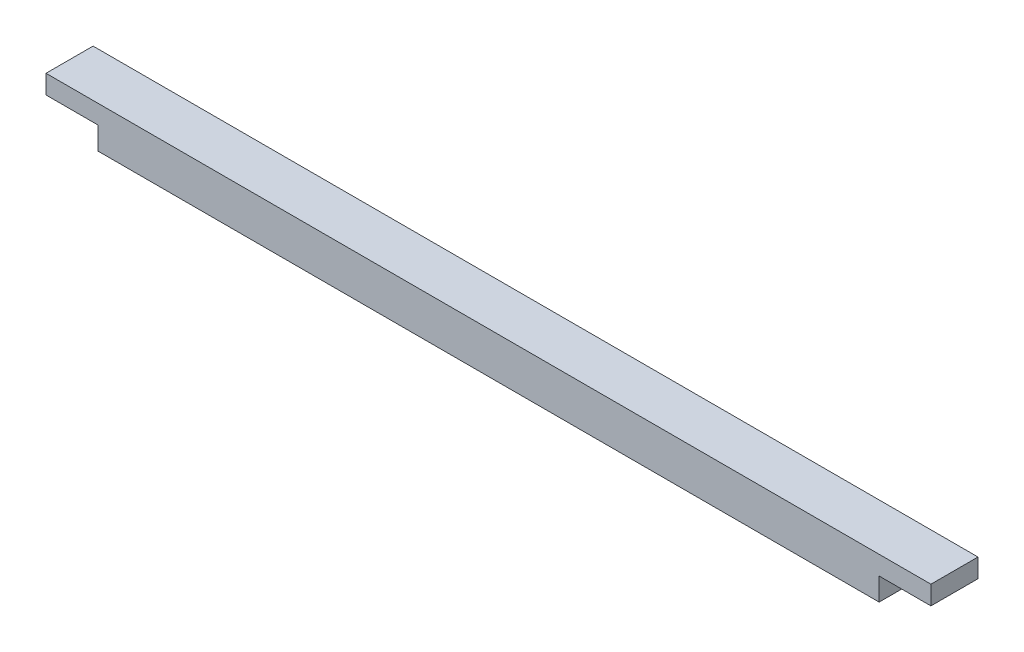
ISO-10303-21;
HEADER;
FILE_DESCRIPTION(('STEP AP214'),'2;1');
FILE_NAME('part.step','',(''),(''),'','','');
FILE_SCHEMA(('AUTOMOTIVE_DESIGN { 1 0 10303 214 1 1 1 1 }'));
ENDSEC;
DATA;
#1=APPLICATION_CONTEXT('core data for automotive mechanical design processes');
#2=APPLICATION_PROTOCOL_DEFINITION('international standard','automotive_design',2000,#1);
#3=PRODUCT_CONTEXT('',#1,'mechanical');
#4=PRODUCT('Part','Part','',(#3));
#5=PRODUCT_RELATED_PRODUCT_CATEGORY('part','',(#4));
#6=PRODUCT_DEFINITION_FORMATION('','',#4);
#7=PRODUCT_DEFINITION_CONTEXT('part definition',#1,'design');
#8=PRODUCT_DEFINITION('design','',#6,#7);
#9=PRODUCT_DEFINITION_SHAPE('','',#8);
#10=(LENGTH_UNIT() NAMED_UNIT(*) SI_UNIT(.MILLI.,.METRE.));
#11=(NAMED_UNIT(*) PLANE_ANGLE_UNIT() SI_UNIT($,.RADIAN.));
#12=(NAMED_UNIT(*) SI_UNIT($,.STERADIAN.) SOLID_ANGLE_UNIT());
#13=UNCERTAINTY_MEASURE_WITH_UNIT(LENGTH_MEASURE(1.E-05),#10,'distance_accuracy_value','');
#14=(GEOMETRIC_REPRESENTATION_CONTEXT(3) GLOBAL_UNCERTAINTY_ASSIGNED_CONTEXT((#13)) GLOBAL_UNIT_ASSIGNED_CONTEXT((#10,
#11,#12)) REPRESENTATION_CONTEXT('',''));
#15=CARTESIAN_POINT('',(0.,0.,0.));
#16=DIRECTION('',(0.,0.,1.));
#17=DIRECTION('',(1.,0.,0.));
#18=AXIS2_PLACEMENT_3D('',#15,#16,#17);
#19=CARTESIAN_POINT('',(0.,22.,0.));
#20=DIRECTION('',(1.,0.,0.));
#21=DIRECTION('',(0.,0.,-1.));
#22=AXIS2_PLACEMENT_3D('',#19,#20,#21);
#23=PLANE('',#22);
#24=DIRECTION('',(0.,-1.,0.));
#25=VECTOR('',#24,1.);
#26=CARTESIAN_POINT('',(0.,22.,-25.));
#27=LINE('',#26,#25);
#28=CARTESIAN_POINT('',(0.,22.,-25.));
#29=VERTEX_POINT('',#28);
#30=CARTESIAN_POINT('',(0.,12.,-25.));
#31=VERTEX_POINT('',#30);
#32=EDGE_CURVE('E156',#29,#31,#27,.T.);
#33=ORIENTED_EDGE('',*,*,#32,.T.);
#34=DIRECTION('',(0.,0.,1.));
#35=VECTOR('',#34,1.);
#36=CARTESIAN_POINT('',(0.,12.,-25.));
#37=LINE('',#36,#35);
#38=CARTESIAN_POINT('',(0.,12.,0.));
#39=VERTEX_POINT('',#38);
#40=EDGE_CURVE('E107',#31,#39,#37,.T.);
#41=ORIENTED_EDGE('',*,*,#40,.T.);
#42=DIRECTION('',(0.,-1.,0.));
#43=VECTOR('',#42,1.);
#44=CARTESIAN_POINT('',(0.,22.,0.));
#45=LINE('',#44,#43);
#46=CARTESIAN_POINT('',(0.,22.,0.));
#47=VERTEX_POINT('',#46);
#48=EDGE_CURVE('E11',#47,#39,#45,.T.);
#49=ORIENTED_EDGE('',*,*,#48,.F.);
#50=DIRECTION('',(0.,0.,1.));
#51=VECTOR('',#50,1.);
#52=CARTESIAN_POINT('',(0.,22.,0.));
#53=LINE('',#52,#51);
#54=EDGE_CURVE('E147',#29,#47,#53,.T.);
#55=ORIENTED_EDGE('',*,*,#54,.F.);
#56=EDGE_LOOP('',(#33,#41,#49,#55));
#57=FACE_BOUND('',#56,.T.);
#58=ADVANCED_FACE('F37',(#57),#23,.F.);
#59=CARTESIAN_POINT('',(0.,22.,0.));
#60=DIRECTION('',(0.,0.,-1.));
#61=DIRECTION('',(-1.,0.,0.));
#62=AXIS2_PLACEMENT_3D('',#59,#60,#61);
#63=PLANE('',#62);
#64=ORIENTED_EDGE('',*,*,#48,.T.);
#65=DIRECTION('',(-1.,0.,0.));
#66=VECTOR('',#65,1.);
#67=CARTESIAN_POINT('',(0.,12.,0.));
#68=LINE('',#67,#66);
#69=CARTESIAN_POINT('',(27.5,12.,0.));
#70=VERTEX_POINT('',#69);
#71=EDGE_CURVE('E123',#70,#39,#68,.T.);
#72=ORIENTED_EDGE('',*,*,#71,.F.);
#73=DIRECTION('',(0.,1.,0.));
#74=VECTOR('',#73,1.);
#75=CARTESIAN_POINT('',(27.5,0.,0.));
#76=LINE('',#75,#74);
#77=CARTESIAN_POINT('',(27.5,0.,0.));
#78=VERTEX_POINT('',#77);
#79=EDGE_CURVE('E104',#78,#70,#76,.T.);
#80=ORIENTED_EDGE('',*,*,#79,.F.);
#81=DIRECTION('',(1.,0.,0.));
#82=VECTOR('',#81,1.);
#83=CARTESIAN_POINT('',(0.,0.,0.));
#84=LINE('',#83,#82);
#85=CARTESIAN_POINT('',(442.5,0.,0.));
#86=VERTEX_POINT('',#85);
#87=EDGE_CURVE('E59',#78,#86,#84,.T.);
#88=ORIENTED_EDGE('',*,*,#87,.T.);
#89=DIRECTION('',(0.,-1.,0.));
#90=VECTOR('',#89,1.);
#91=CARTESIAN_POINT('',(442.5,0.,0.));
#92=LINE('',#91,#90);
#93=CARTESIAN_POINT('',(442.5,12.,0.));
#94=VERTEX_POINT('',#93);
#95=EDGE_CURVE('E135',#94,#86,#92,.T.);
#96=ORIENTED_EDGE('',*,*,#95,.F.);
#97=DIRECTION('',(-1.,0.,0.));
#98=VECTOR('',#97,1.);
#99=CARTESIAN_POINT('',(470.,12.,0.));
#100=LINE('',#99,#98);
#101=CARTESIAN_POINT('',(470.,12.,0.));
#102=VERTEX_POINT('',#101);
#103=EDGE_CURVE('E128',#102,#94,#100,.T.);
#104=ORIENTED_EDGE('',*,*,#103,.F.);
#105=DIRECTION('',(0.,-1.,0.));
#106=VECTOR('',#105,1.);
#107=CARTESIAN_POINT('',(470.,22.,0.));
#108=LINE('',#107,#106);
#109=CARTESIAN_POINT('',(470.,22.,0.));
#110=VERTEX_POINT('',#109);
#111=EDGE_CURVE('E44',#110,#102,#108,.T.);
#112=ORIENTED_EDGE('',*,*,#111,.F.);
#113=DIRECTION('',(1.,0.,0.));
#114=VECTOR('',#113,1.);
#115=CARTESIAN_POINT('',(0.,22.,0.));
#116=LINE('',#115,#114);
#117=EDGE_CURVE('E150',#47,#110,#116,.T.);
#118=ORIENTED_EDGE('',*,*,#117,.F.);
#119=EDGE_LOOP('',(#64,#72,#80,#88,#96,#104,#112,#118));
#120=FACE_BOUND('',#119,.T.);
#121=ADVANCED_FACE('F170',(#120),#63,.F.);
#122=CARTESIAN_POINT('',(470.,22.,0.));
#123=DIRECTION('',(-1.,0.,0.));
#124=DIRECTION('',(0.,0.,1.));
#125=AXIS2_PLACEMENT_3D('',#122,#123,#124);
#126=PLANE('',#125);
#127=ORIENTED_EDGE('',*,*,#111,.T.);
#128=DIRECTION('',(0.,0.,1.));
#129=VECTOR('',#128,1.);
#130=CARTESIAN_POINT('',(470.,12.,-25.));
#131=LINE('',#130,#129);
#132=CARTESIAN_POINT('',(470.,12.,-25.));
#133=VERTEX_POINT('',#132);
#134=EDGE_CURVE('E137',#133,#102,#131,.T.);
#135=ORIENTED_EDGE('',*,*,#134,.F.);
#136=DIRECTION('',(0.,-1.,0.));
#137=VECTOR('',#136,1.);
#138=CARTESIAN_POINT('',(470.,22.,-25.));
#139=LINE('',#138,#137);
#140=CARTESIAN_POINT('',(470.,22.,-25.));
#141=VERTEX_POINT('',#140);
#142=EDGE_CURVE('E160',#141,#133,#139,.T.);
#143=ORIENTED_EDGE('',*,*,#142,.F.);
#144=DIRECTION('',(0.,0.,-1.));
#145=VECTOR('',#144,1.);
#146=CARTESIAN_POINT('',(470.,22.,0.));
#147=LINE('',#146,#145);
#148=EDGE_CURVE('E152',#110,#141,#147,.T.);
#149=ORIENTED_EDGE('',*,*,#148,.F.);
#150=EDGE_LOOP('',(#127,#135,#143,#149));
#151=FACE_BOUND('',#150,.T.);
#152=ADVANCED_FACE('F167',(#151),#126,.F.);
#153=CARTESIAN_POINT('',(0.,22.,-25.));
#154=DIRECTION('',(0.,0.,1.));
#155=DIRECTION('',(1.,0.,0.));
#156=AXIS2_PLACEMENT_3D('',#153,#154,#155);
#157=PLANE('',#156);
#158=DIRECTION('',(0.,1.,0.));
#159=VECTOR('',#158,1.);
#160=CARTESIAN_POINT('',(27.5,0.,-25.));
#161=LINE('',#160,#159);
#162=CARTESIAN_POINT('',(27.5,0.,-25.));
#163=VERTEX_POINT('',#162);
#164=CARTESIAN_POINT('',(27.5,12.,-25.));
#165=VERTEX_POINT('',#164);
#166=EDGE_CURVE('E51',#163,#165,#161,.T.);
#167=ORIENTED_EDGE('',*,*,#166,.T.);
#168=DIRECTION('',(-1.,0.,0.));
#169=VECTOR('',#168,1.);
#170=CARTESIAN_POINT('',(0.,12.,-25.));
#171=LINE('',#170,#169);
#172=EDGE_CURVE('E111',#165,#31,#171,.T.);
#173=ORIENTED_EDGE('',*,*,#172,.T.);
#174=ORIENTED_EDGE('',*,*,#32,.F.);
#175=DIRECTION('',(-1.,0.,0.));
#176=VECTOR('',#175,1.);
#177=CARTESIAN_POINT('',(0.,22.,-25.));
#178=LINE('',#177,#176);
#179=EDGE_CURVE('E154',#141,#29,#178,.T.);
#180=ORIENTED_EDGE('',*,*,#179,.F.);
#181=ORIENTED_EDGE('',*,*,#142,.T.);
#182=DIRECTION('',(-1.,0.,0.));
#183=VECTOR('',#182,1.);
#184=CARTESIAN_POINT('',(470.,12.,-25.));
#185=LINE('',#184,#183);
#186=CARTESIAN_POINT('',(442.5,12.,-25.));
#187=VERTEX_POINT('',#186);
#188=EDGE_CURVE('E131',#133,#187,#185,.T.);
#189=ORIENTED_EDGE('',*,*,#188,.T.);
#190=DIRECTION('',(0.,-1.,0.));
#191=VECTOR('',#190,1.);
#192=CARTESIAN_POINT('',(442.5,0.,-25.));
#193=LINE('',#192,#191);
#194=CARTESIAN_POINT('',(442.5,0.,-25.));
#195=VERTEX_POINT('',#194);
#196=EDGE_CURVE('E134',#187,#195,#193,.T.);
#197=ORIENTED_EDGE('',*,*,#196,.T.);
#198=DIRECTION('',(-1.,0.,0.));
#199=VECTOR('',#198,1.);
#200=CARTESIAN_POINT('',(0.,0.,-25.));
#201=LINE('',#200,#199);
#202=EDGE_CURVE('E122',#195,#163,#201,.T.);
#203=ORIENTED_EDGE('',*,*,#202,.T.);
#204=EDGE_LOOP('',(#167,#173,#174,#180,#181,#189,#197,#203));
#205=FACE_BOUND('',#204,.T.);
#206=ADVANCED_FACE('F119',(#205),#157,.F.);
#207=CARTESIAN_POINT('',(0.,22.,0.));
#208=DIRECTION('',(0.,-1.,0.));
#209=DIRECTION('',(0.,0.,-1.));
#210=AXIS2_PLACEMENT_3D('',#207,#208,#209);
#211=PLANE('',#210);
#212=ORIENTED_EDGE('',*,*,#54,.T.);
#213=ORIENTED_EDGE('',*,*,#117,.T.);
#214=ORIENTED_EDGE('',*,*,#148,.T.);
#215=ORIENTED_EDGE('',*,*,#179,.T.);
#216=EDGE_LOOP('',(#212,#213,#214,#215));
#217=FACE_BOUND('',#216,.T.);
#218=ADVANCED_FACE('F177',(#217),#211,.F.);
#219=CARTESIAN_POINT('',(0.,0.,0.));
#220=DIRECTION('',(0.,-1.,0.));
#221=DIRECTION('',(0.,0.,-1.));
#222=AXIS2_PLACEMENT_3D('',#219,#220,#221);
#223=PLANE('',#222);
#224=DIRECTION('',(0.,0.,1.));
#225=VECTOR('',#224,1.);
#226=CARTESIAN_POINT('',(27.5,0.,-25.));
#227=LINE('',#226,#225);
#228=EDGE_CURVE('E108',#163,#78,#227,.T.);
#229=ORIENTED_EDGE('',*,*,#228,.F.);
#230=ORIENTED_EDGE('',*,*,#202,.F.);
#231=DIRECTION('',(0.,0.,1.));
#232=VECTOR('',#231,1.);
#233=CARTESIAN_POINT('',(442.5,0.,-25.));
#234=LINE('',#233,#232);
#235=EDGE_CURVE('E141',#195,#86,#234,.T.);
#236=ORIENTED_EDGE('',*,*,#235,.T.);
#237=ORIENTED_EDGE('',*,*,#87,.F.);
#238=EDGE_LOOP('',(#229,#230,#236,#237));
#239=FACE_BOUND('',#238,.T.);
#240=ADVANCED_FACE('F181',(#239),#223,.T.);
#241=CARTESIAN_POINT('',(442.5,0.,-25.));
#242=DIRECTION('',(-1.,0.,0.));
#243=DIRECTION('',(0.,0.,1.));
#244=AXIS2_PLACEMENT_3D('',#241,#242,#243);
#245=PLANE('',#244);
#246=ORIENTED_EDGE('',*,*,#95,.T.);
#247=ORIENTED_EDGE('',*,*,#235,.F.);
#248=ORIENTED_EDGE('',*,*,#196,.F.);
#249=DIRECTION('',(0.,0.,1.));
#250=VECTOR('',#249,1.);
#251=CARTESIAN_POINT('',(442.5,12.,-25.));
#252=LINE('',#251,#250);
#253=EDGE_CURVE('E144',#187,#94,#252,.T.);
#254=ORIENTED_EDGE('',*,*,#253,.T.);
#255=EDGE_LOOP('',(#246,#247,#248,#254));
#256=FACE_BOUND('',#255,.T.);
#257=ADVANCED_FACE('F183',(#256),#245,.F.);
#258=CARTESIAN_POINT('',(470.,12.,-25.));
#259=DIRECTION('',(0.,1.,0.));
#260=DIRECTION('',(-1.,0.,0.));
#261=AXIS2_PLACEMENT_3D('',#258,#259,#260);
#262=PLANE('',#261);
#263=ORIENTED_EDGE('',*,*,#103,.T.);
#264=ORIENTED_EDGE('',*,*,#253,.F.);
#265=ORIENTED_EDGE('',*,*,#188,.F.);
#266=ORIENTED_EDGE('',*,*,#134,.T.);
#267=EDGE_LOOP('',(#263,#264,#265,#266));
#268=FACE_BOUND('',#267,.T.);
#269=ADVANCED_FACE('F172',(#268),#262,.F.);
#270=CARTESIAN_POINT('',(0.,12.,-25.));
#271=DIRECTION('',(0.,1.,0.));
#272=DIRECTION('',(0.,0.,1.));
#273=AXIS2_PLACEMENT_3D('',#270,#271,#272);
#274=PLANE('',#273);
#275=ORIENTED_EDGE('',*,*,#71,.T.);
#276=ORIENTED_EDGE('',*,*,#40,.F.);
#277=ORIENTED_EDGE('',*,*,#172,.F.);
#278=DIRECTION('',(0.,0.,1.));
#279=VECTOR('',#278,1.);
#280=CARTESIAN_POINT('',(27.5,12.,-25.));
#281=LINE('',#280,#279);
#282=EDGE_CURVE('E101',#165,#70,#281,.T.);
#283=ORIENTED_EDGE('',*,*,#282,.T.);
#284=EDGE_LOOP('',(#275,#276,#277,#283));
#285=FACE_BOUND('',#284,.T.);
#286=ADVANCED_FACE('F112',(#285),#274,.F.);
#287=CARTESIAN_POINT('',(27.5,0.,-25.));
#288=DIRECTION('',(1.,0.,0.));
#289=DIRECTION('',(0.,0.,-1.));
#290=AXIS2_PLACEMENT_3D('',#287,#288,#289);
#291=PLANE('',#290);
#292=ORIENTED_EDGE('',*,*,#79,.T.);
#293=ORIENTED_EDGE('',*,*,#282,.F.);
#294=ORIENTED_EDGE('',*,*,#166,.F.);
#295=ORIENTED_EDGE('',*,*,#228,.T.);
#296=EDGE_LOOP('',(#292,#293,#294,#295));
#297=FACE_BOUND('',#296,.T.);
#298=ADVANCED_FACE('F103',(#297),#291,.F.);
#299=CLOSED_SHELL('',(#58,#121,#152,#206,#218,#240,#257,#269,#286,#298));
#300=MANIFOLD_SOLID_BREP('B2',#299);
#301=ADVANCED_BREP_SHAPE_REPRESENTATION('',(#18,#300),#14);
#302=SHAPE_DEFINITION_REPRESENTATION(#9,#301);
ENDSEC;
END-ISO-10303-21;
